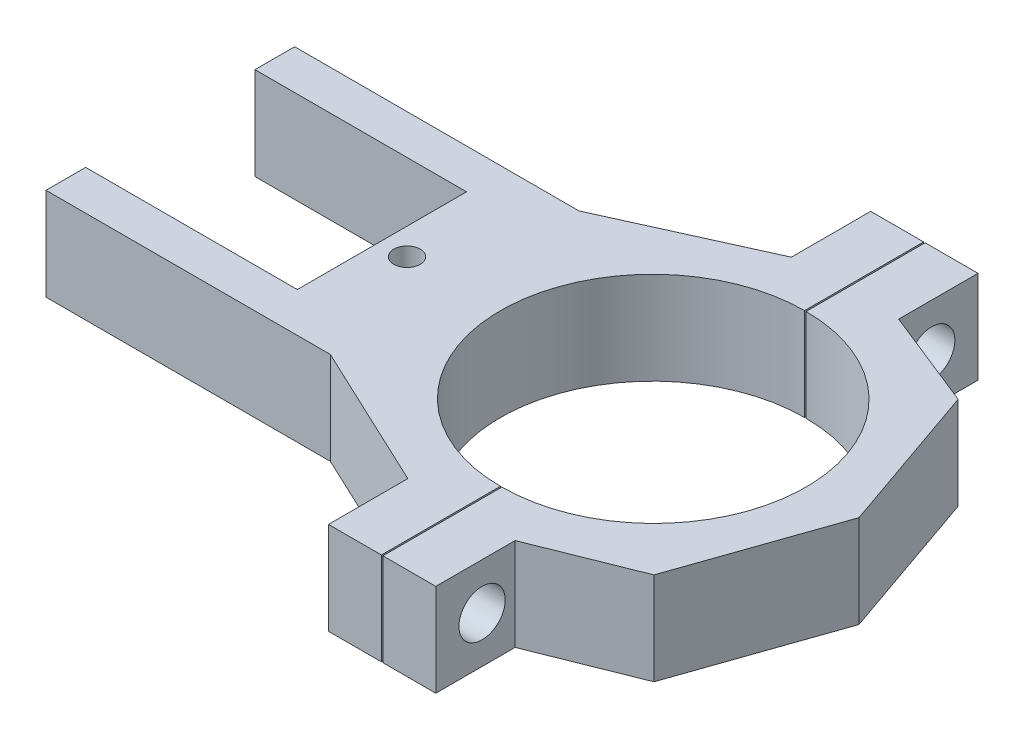
ISO-10303-21;
HEADER;
FILE_DESCRIPTION(('STEP AP214'),'2;1');
FILE_NAME('part.step','',(''),(''),'','','');
FILE_SCHEMA(('AUTOMOTIVE_DESIGN { 1 0 10303 214 1 1 1 1 }'));
ENDSEC;
DATA;
#1=APPLICATION_CONTEXT('core data for automotive mechanical design processes');
#2=APPLICATION_PROTOCOL_DEFINITION('international standard','automotive_design',2000,#1);
#3=PRODUCT_CONTEXT('',#1,'mechanical');
#4=PRODUCT('Part','Part','',(#3));
#5=PRODUCT_RELATED_PRODUCT_CATEGORY('part','',(#4));
#6=PRODUCT_DEFINITION_FORMATION('','',#4);
#7=PRODUCT_DEFINITION_CONTEXT('part definition',#1,'design');
#8=PRODUCT_DEFINITION('design','',#6,#7);
#9=PRODUCT_DEFINITION_SHAPE('','',#8);
#10=(LENGTH_UNIT() NAMED_UNIT(*) SI_UNIT(.MILLI.,.METRE.));
#11=(NAMED_UNIT(*) PLANE_ANGLE_UNIT() SI_UNIT($,.RADIAN.));
#12=(NAMED_UNIT(*) SI_UNIT($,.STERADIAN.) SOLID_ANGLE_UNIT());
#13=UNCERTAINTY_MEASURE_WITH_UNIT(LENGTH_MEASURE(1.E-05),#10,'distance_accuracy_value','');
#14=(GEOMETRIC_REPRESENTATION_CONTEXT(3) GLOBAL_UNCERTAINTY_ASSIGNED_CONTEXT((#13)) GLOBAL_UNIT_ASSIGNED_CONTEXT((#10,
#11,#12)) REPRESENTATION_CONTEXT('',''));
#15=CARTESIAN_POINT('',(0.,0.,0.));
#16=DIRECTION('',(0.,0.,1.));
#17=DIRECTION('',(1.,0.,0.));
#18=AXIS2_PLACEMENT_3D('',#15,#16,#17);
#19=CARTESIAN_POINT('',(23.4249580344917,7.,3.4829096426353));
#20=DIRECTION('',(0.,-1.,0.));
#21=DIRECTION('',(0.,0.,-1.));
#22=AXIS2_PLACEMENT_3D('',#19,#20,#21);
#23=CYLINDRICAL_SURFACE('',#22,11.4994374861079);
#24=CARTESIAN_POINT('',(23.4249580344917,0.,3.4829096426353));
#25=DIRECTION('',(0.,-1.,0.));
#26=DIRECTION('',(0.,0.,1.));
#27=AXIS2_PLACEMENT_3D('',#24,#25,#26);
#28=CIRCLE('',#27,11.4994374861079);
#29=CARTESIAN_POINT('',(23.4249580344917,0.,-8.01652784347259));
#30=VERTEX_POINT('',#29);
#31=CARTESIAN_POINT('',(23.4249580344917,0.,14.9823471287432));
#32=VERTEX_POINT('',#31);
#33=EDGE_CURVE('E161',#30,#32,#28,.T.);
#34=ORIENTED_EDGE('',*,*,#33,.T.);
#35=DIRECTION('',(0.,-1.,0.));
#36=VECTOR('',#35,1.);
#37=CARTESIAN_POINT('',(23.4249580344917,7.,14.9823471287432));
#38=LINE('',#37,#36);
#39=CARTESIAN_POINT('',(23.4249580344917,7.,14.9823471287432));
#40=VERTEX_POINT('',#39);
#41=EDGE_CURVE('E12',#40,#32,#38,.T.);
#42=ORIENTED_EDGE('',*,*,#41,.F.);
#43=CARTESIAN_POINT('',(23.4249580344917,7.,3.4829096426353));
#44=DIRECTION('',(0.,-1.,0.));
#45=DIRECTION('',(0.,0.,1.));
#46=AXIS2_PLACEMENT_3D('',#43,#44,#45);
#47=CIRCLE('',#46,11.4994374861079);
#48=CARTESIAN_POINT('',(23.4249580344917,7.,-8.01652784347259));
#49=VERTEX_POINT('',#48);
#50=EDGE_CURVE('E182',#49,#40,#47,.T.);
#51=ORIENTED_EDGE('',*,*,#50,.F.);
#52=DIRECTION('',(0.,-1.,0.));
#53=VECTOR('',#52,1.);
#54=CARTESIAN_POINT('',(23.4249580344917,7.,-8.01652784347259));
#55=LINE('',#54,#53);
#56=EDGE_CURVE('E157',#49,#30,#55,.T.);
#57=ORIENTED_EDGE('',*,*,#56,.T.);
#58=EDGE_LOOP('',(#34,#42,#51,#57));
#59=FACE_BOUND('',#58,.T.);
#60=ADVANCED_FACE('F45',(#59),#23,.F.);
#61=CARTESIAN_POINT('',(23.4249580344917,7.,14.9823471287432));
#62=DIRECTION('',(1.,0.,0.));
#63=DIRECTION('',(0.,0.,-1.));
#64=AXIS2_PLACEMENT_3D('',#61,#62,#63);
#65=PLANE('',#64);
#66=CARTESIAN_POINT('',(23.4249580344917,3.5,20.4829096426353));
#67=DIRECTION('',(1.,0.,0.));
#68=DIRECTION('',(0.,0.,-1.));
#69=AXIS2_PLACEMENT_3D('',#66,#67,#68);
#70=CIRCLE('',#69,1.75);
#71=CARTESIAN_POINT('',(23.4249580344917,3.5,18.7329096426353));
#72=VERTEX_POINT('',#71);
#73=EDGE_CURVE('E165',#72,#72,#70,.T.);
#74=ORIENTED_EDGE('',*,*,#73,.T.);
#75=EDGE_LOOP('',(#74));
#76=FACE_BOUND('',#75,.T.);
#77=DIRECTION('',(0.,0.,1.));
#78=VECTOR('',#77,1.);
#79=CARTESIAN_POINT('',(23.4249580344917,0.,14.9823471287432));
#80=LINE('',#79,#78);
#81=CARTESIAN_POINT('',(23.4249580344917,0.,23.9823471287432));
#82=VERTEX_POINT('',#81);
#83=EDGE_CURVE('E164',#32,#82,#80,.T.);
#84=ORIENTED_EDGE('',*,*,#83,.T.);
#85=DIRECTION('',(0.,-1.,0.));
#86=VECTOR('',#85,1.);
#87=CARTESIAN_POINT('',(23.4249580344917,7.,23.9823471287432));
#88=LINE('',#87,#86);
#89=CARTESIAN_POINT('',(23.4249580344917,7.,23.9823471287432));
#90=VERTEX_POINT('',#89);
#91=EDGE_CURVE('E54',#90,#82,#88,.T.);
#92=ORIENTED_EDGE('',*,*,#91,.F.);
#93=DIRECTION('',(0.,0.,1.));
#94=VECTOR('',#93,1.);
#95=CARTESIAN_POINT('',(23.4249580344917,7.,14.9823471287432));
#96=LINE('',#95,#94);
#97=EDGE_CURVE('E115',#40,#90,#96,.T.);
#98=ORIENTED_EDGE('',*,*,#97,.F.);
#99=ORIENTED_EDGE('',*,*,#41,.T.);
#100=EDGE_LOOP('',(#84,#92,#98,#99));
#101=FACE_BOUND('',#100,.T.);
#102=ADVANCED_FACE('F255',(#76,#101),#65,.F.);
#103=CARTESIAN_POINT('',(23.4249580344917,7.,23.9823471287432));
#104=DIRECTION('',(0.,0.,-1.));
#105=DIRECTION('',(-1.,0.,0.));
#106=AXIS2_PLACEMENT_3D('',#103,#104,#105);
#107=PLANE('',#106);
#108=DIRECTION('',(1.,0.,0.));
#109=VECTOR('',#108,1.);
#110=CARTESIAN_POINT('',(23.4249580344917,0.,23.9823471287432));
#111=LINE('',#110,#109);
#112=CARTESIAN_POINT('',(27.4249580344917,0.,23.9823471287432));
#113=VERTEX_POINT('',#112);
#114=EDGE_CURVE('E167',#82,#113,#111,.T.);
#115=ORIENTED_EDGE('',*,*,#114,.T.);
#116=DIRECTION('',(0.,-1.,0.));
#117=VECTOR('',#116,1.);
#118=CARTESIAN_POINT('',(27.4249580344917,7.,23.9823471287432));
#119=LINE('',#118,#117);
#120=CARTESIAN_POINT('',(27.4249580344917,7.,23.9823471287432));
#121=VERTEX_POINT('',#120);
#122=EDGE_CURVE('E198',#121,#113,#119,.T.);
#123=ORIENTED_EDGE('',*,*,#122,.F.);
#124=DIRECTION('',(1.,0.,0.));
#125=VECTOR('',#124,1.);
#126=CARTESIAN_POINT('',(23.4249580344917,7.,23.9823471287432));
#127=LINE('',#126,#125);
#128=EDGE_CURVE('E217',#90,#121,#127,.T.);
#129=ORIENTED_EDGE('',*,*,#128,.F.);
#130=ORIENTED_EDGE('',*,*,#91,.T.);
#131=EDGE_LOOP('',(#115,#123,#129,#130));
#132=FACE_BOUND('',#131,.T.);
#133=ADVANCED_FACE('F259',(#132),#107,.F.);
#134=CARTESIAN_POINT('',(27.4249580344917,7.,23.9823471287432));
#135=DIRECTION('',(-1.,0.,0.));
#136=DIRECTION('',(0.,0.,1.));
#137=AXIS2_PLACEMENT_3D('',#134,#135,#136);
#138=PLANE('',#137);
#139=CARTESIAN_POINT('',(27.4249580344917,3.5,20.4829096426353));
#140=DIRECTION('',(-1.,0.,0.));
#141=DIRECTION('',(0.,0.,1.));
#142=AXIS2_PLACEMENT_3D('',#139,#140,#141);
#143=CIRCLE('',#142,1.75);
#144=CARTESIAN_POINT('',(27.4249580344917,3.5,22.2329096426353));
#145=VERTEX_POINT('',#144);
#146=EDGE_CURVE('E202',#145,#145,#143,.T.);
#147=ORIENTED_EDGE('',*,*,#146,.T.);
#148=EDGE_LOOP('',(#147));
#149=FACE_BOUND('',#148,.T.);
#150=DIRECTION('',(0.,0.,-1.));
#151=VECTOR('',#150,1.);
#152=CARTESIAN_POINT('',(27.4249580344917,0.,23.9823471287432));
#153=LINE('',#152,#151);
#154=CARTESIAN_POINT('',(27.4249580344917,0.,17.9823471287432));
#155=VERTEX_POINT('',#154);
#156=EDGE_CURVE('E169',#113,#155,#153,.T.);
#157=ORIENTED_EDGE('',*,*,#156,.T.);
#158=DIRECTION('',(0.,-1.,0.));
#159=VECTOR('',#158,1.);
#160=CARTESIAN_POINT('',(27.4249580344917,7.,17.9823471287432));
#161=LINE('',#160,#159);
#162=CARTESIAN_POINT('',(27.4249580344917,7.,17.9823471287432));
#163=VERTEX_POINT('',#162);
#164=EDGE_CURVE('E195',#163,#155,#161,.T.);
#165=ORIENTED_EDGE('',*,*,#164,.F.);
#166=DIRECTION('',(0.,0.,-1.));
#167=VECTOR('',#166,1.);
#168=CARTESIAN_POINT('',(27.4249580344917,7.,23.9823471287432));
#169=LINE('',#168,#167);
#170=EDGE_CURVE('E219',#121,#163,#169,.T.);
#171=ORIENTED_EDGE('',*,*,#170,.F.);
#172=ORIENTED_EDGE('',*,*,#122,.T.);
#173=EDGE_LOOP('',(#157,#165,#171,#172));
#174=FACE_BOUND('',#173,.T.);
#175=ADVANCED_FACE('F264',(#149,#174),#138,.F.);
#176=CARTESIAN_POINT('',(34.9243955205996,7.,14.9823471287432));
#177=DIRECTION('',(-0.371414690703817,0.,-0.928467084785125));
#178=DIRECTION('',(-0.928467084785125,0.,0.371414690703817));
#179=AXIS2_PLACEMENT_3D('',#176,#177,#178);
#180=PLANE('',#179);
#181=DIRECTION('',(0.928467084785125,0.,-0.371414690703817));
#182=VECTOR('',#181,1.);
#183=CARTESIAN_POINT('',(34.9243955205996,0.,14.9823471287432));
#184=LINE('',#183,#182);
#185=CARTESIAN_POINT('',(34.9243955205996,0.,14.9823471287432));
#186=VERTEX_POINT('',#185);
#187=EDGE_CURVE('E171',#155,#186,#184,.T.);
#188=ORIENTED_EDGE('',*,*,#187,.T.);
#189=DIRECTION('',(0.,-1.,0.));
#190=VECTOR('',#189,1.);
#191=CARTESIAN_POINT('',(34.9243955205996,7.,14.9823471287432));
#192=LINE('',#191,#190);
#193=CARTESIAN_POINT('',(34.9243955205996,7.,14.9823471287432));
#194=VERTEX_POINT('',#193);
#195=EDGE_CURVE('E192',#194,#186,#192,.T.);
#196=ORIENTED_EDGE('',*,*,#195,.F.);
#197=DIRECTION('',(0.928467084785125,0.,-0.371414690703817));
#198=VECTOR('',#197,1.);
#199=CARTESIAN_POINT('',(34.9243955205996,7.,14.9823471287432));
#200=LINE('',#199,#198);
#201=EDGE_CURVE('E221',#163,#194,#200,.T.);
#202=ORIENTED_EDGE('',*,*,#201,.F.);
#203=ORIENTED_EDGE('',*,*,#164,.T.);
#204=EDGE_LOOP('',(#188,#196,#202,#203));
#205=FACE_BOUND('',#204,.T.);
#206=ADVANCED_FACE('F270',(#205),#180,.F.);
#207=CARTESIAN_POINT('',(38.9249580344917,7.,3.48290964263533));
#208=DIRECTION('',(-0.944477473376483,0.,-0.328576174249404));
#209=DIRECTION('',(-0.328576174249404,0.,0.944477473376483));
#210=AXIS2_PLACEMENT_3D('',#207,#208,#209);
#211=PLANE('',#210);
#212=DIRECTION('',(0.328576174249404,0.,-0.944477473376483));
#213=VECTOR('',#212,1.);
#214=CARTESIAN_POINT('',(38.9249580344917,0.,3.48290964263533));
#215=LINE('',#214,#213);
#216=CARTESIAN_POINT('',(38.9249580344917,0.,3.48290964263533));
#217=VERTEX_POINT('',#216);
#218=EDGE_CURVE('E173',#186,#217,#215,.T.);
#219=ORIENTED_EDGE('',*,*,#218,.T.);
#220=DIRECTION('',(0.,-1.,0.));
#221=VECTOR('',#220,1.);
#222=CARTESIAN_POINT('',(38.9249580344917,7.,3.48290964263533));
#223=LINE('',#222,#221);
#224=CARTESIAN_POINT('',(38.9249580344917,7.,3.48290964263533));
#225=VERTEX_POINT('',#224);
#226=EDGE_CURVE('E189',#225,#217,#223,.T.);
#227=ORIENTED_EDGE('',*,*,#226,.F.);
#228=DIRECTION('',(0.328576174249404,0.,-0.944477473376483));
#229=VECTOR('',#228,1.);
#230=CARTESIAN_POINT('',(38.9249580344917,7.,3.48290964263533));
#231=LINE('',#230,#229);
#232=EDGE_CURVE('E223',#194,#225,#231,.T.);
#233=ORIENTED_EDGE('',*,*,#232,.F.);
#234=ORIENTED_EDGE('',*,*,#195,.T.);
#235=EDGE_LOOP('',(#219,#227,#233,#234));
#236=FACE_BOUND('',#235,.T.);
#237=ADVANCED_FACE('F273',(#236),#211,.F.);
#238=CARTESIAN_POINT('',(34.9243955205996,7.,-8.01652784347259));
#239=DIRECTION('',(-0.944477473376483,0.,0.328576174249402));
#240=DIRECTION('',(0.328576174249402,0.,0.944477473376484));
#241=AXIS2_PLACEMENT_3D('',#238,#239,#240);
#242=PLANE('',#241);
#243=DIRECTION('',(-0.328576174249402,0.,-0.944477473376483));
#244=VECTOR('',#243,1.);
#245=CARTESIAN_POINT('',(34.9243955205996,0.,-8.01652784347259));
#246=LINE('',#245,#244);
#247=CARTESIAN_POINT('',(34.9243955205996,0.,-8.01652784347259));
#248=VERTEX_POINT('',#247);
#249=EDGE_CURVE('E175',#217,#248,#246,.T.);
#250=ORIENTED_EDGE('',*,*,#249,.T.);
#251=DIRECTION('',(0.,-1.,0.));
#252=VECTOR('',#251,1.);
#253=CARTESIAN_POINT('',(34.9243955205996,7.,-8.01652784347259));
#254=LINE('',#253,#252);
#255=CARTESIAN_POINT('',(34.9243955205996,7.,-8.01652784347259));
#256=VERTEX_POINT('',#255);
#257=EDGE_CURVE('E186',#256,#248,#254,.T.);
#258=ORIENTED_EDGE('',*,*,#257,.F.);
#259=DIRECTION('',(-0.328576174249402,0.,-0.944477473376483));
#260=VECTOR('',#259,1.);
#261=CARTESIAN_POINT('',(34.9243955205996,7.,-8.01652784347259));
#262=LINE('',#261,#260);
#263=EDGE_CURVE('E225',#225,#256,#262,.T.);
#264=ORIENTED_EDGE('',*,*,#263,.F.);
#265=ORIENTED_EDGE('',*,*,#226,.T.);
#266=EDGE_LOOP('',(#250,#258,#264,#265));
#267=FACE_BOUND('',#266,.T.);
#268=ADVANCED_FACE('F231',(#267),#242,.F.);
#269=CARTESIAN_POINT('',(27.4249580344917,7.,-11.0165278434726));
#270=DIRECTION('',(-0.371414690703817,0.,0.928467084785125));
#271=DIRECTION('',(0.928467084785125,0.,0.371414690703817));
#272=AXIS2_PLACEMENT_3D('',#269,#270,#271);
#273=PLANE('',#272);
#274=DIRECTION('',(-0.928467084785125,0.,-0.371414690703817));
#275=VECTOR('',#274,1.);
#276=CARTESIAN_POINT('',(27.4249580344917,0.,-11.0165278434726));
#277=LINE('',#276,#275);
#278=CARTESIAN_POINT('',(27.4249580344917,0.,-11.0165278434726));
#279=VERTEX_POINT('',#278);
#280=EDGE_CURVE('E177',#248,#279,#277,.T.);
#281=ORIENTED_EDGE('',*,*,#280,.T.);
#282=DIRECTION('',(0.,-1.,0.));
#283=VECTOR('',#282,1.);
#284=CARTESIAN_POINT('',(27.4249580344917,7.,-11.0165278434726));
#285=LINE('',#284,#283);
#286=CARTESIAN_POINT('',(27.4249580344917,7.,-11.0165278434726));
#287=VERTEX_POINT('',#286);
#288=EDGE_CURVE('E152',#287,#279,#285,.T.);
#289=ORIENTED_EDGE('',*,*,#288,.F.);
#290=DIRECTION('',(-0.928467084785125,0.,-0.371414690703817));
#291=VECTOR('',#290,1.);
#292=CARTESIAN_POINT('',(27.4249580344917,7.,-11.0165278434726));
#293=LINE('',#292,#291);
#294=EDGE_CURVE('E143',#256,#287,#293,.T.);
#295=ORIENTED_EDGE('',*,*,#294,.F.);
#296=ORIENTED_EDGE('',*,*,#257,.T.);
#297=EDGE_LOOP('',(#281,#289,#295,#296));
#298=FACE_BOUND('',#297,.T.);
#299=ADVANCED_FACE('F235',(#298),#273,.F.);
#300=CARTESIAN_POINT('',(27.4249580344917,7.,-17.0165278434726));
#301=DIRECTION('',(-1.,0.,0.));
#302=DIRECTION('',(0.,0.,1.));
#303=AXIS2_PLACEMENT_3D('',#300,#301,#302);
#304=PLANE('',#303);
#305=CARTESIAN_POINT('',(27.4249580344917,3.5,-13.5170903573647));
#306=DIRECTION('',(-1.,0.,0.));
#307=DIRECTION('',(0.,0.,1.));
#308=AXIS2_PLACEMENT_3D('',#305,#306,#307);
#309=CIRCLE('',#308,1.75);
#310=CARTESIAN_POINT('',(27.4249580344917,3.5,-11.7670903573647));
#311=VERTEX_POINT('',#310);
#312=EDGE_CURVE('E204',#311,#311,#309,.T.);
#313=ORIENTED_EDGE('',*,*,#312,.T.);
#314=EDGE_LOOP('',(#313));
#315=FACE_BOUND('',#314,.T.);
#316=DIRECTION('',(0.,0.,-1.));
#317=VECTOR('',#316,1.);
#318=CARTESIAN_POINT('',(27.4249580344917,0.,-17.0165278434726));
#319=LINE('',#318,#317);
#320=CARTESIAN_POINT('',(27.4249580344917,0.,-17.0165278434726));
#321=VERTEX_POINT('',#320);
#322=EDGE_CURVE('E151',#279,#321,#319,.T.);
#323=ORIENTED_EDGE('',*,*,#322,.T.);
#324=DIRECTION('',(0.,-1.,0.));
#325=VECTOR('',#324,1.);
#326=CARTESIAN_POINT('',(27.4249580344917,7.,-17.0165278434726));
#327=LINE('',#326,#325);
#328=CARTESIAN_POINT('',(27.4249580344917,7.,-17.0165278434726));
#329=VERTEX_POINT('',#328);
#330=EDGE_CURVE('E148',#329,#321,#327,.T.);
#331=ORIENTED_EDGE('',*,*,#330,.F.);
#332=DIRECTION('',(0.,0.,-1.));
#333=VECTOR('',#332,1.);
#334=CARTESIAN_POINT('',(27.4249580344917,7.,-17.0165278434726));
#335=LINE('',#334,#333);
#336=EDGE_CURVE('E137',#287,#329,#335,.T.);
#337=ORIENTED_EDGE('',*,*,#336,.F.);
#338=ORIENTED_EDGE('',*,*,#288,.T.);
#339=EDGE_LOOP('',(#323,#331,#337,#338));
#340=FACE_BOUND('',#339,.T.);
#341=ADVANCED_FACE('F149',(#315,#340),#304,.F.);
#342=CARTESIAN_POINT('',(23.4249580344917,7.,-17.0165278434726));
#343=DIRECTION('',(0.,0.,1.));
#344=DIRECTION('',(1.,0.,0.));
#345=AXIS2_PLACEMENT_3D('',#342,#343,#344);
#346=PLANE('',#345);
#347=DIRECTION('',(-1.,0.,0.));
#348=VECTOR('',#347,1.);
#349=CARTESIAN_POINT('',(23.4249580344917,0.,-17.0165278434726));
#350=LINE('',#349,#348);
#351=CARTESIAN_POINT('',(23.4249580344917,0.,-17.0165278434726));
#352=VERTEX_POINT('',#351);
#353=EDGE_CURVE('E101',#321,#352,#350,.T.);
#354=ORIENTED_EDGE('',*,*,#353,.T.);
#355=DIRECTION('',(0.,-1.,0.));
#356=VECTOR('',#355,1.);
#357=CARTESIAN_POINT('',(23.4249580344917,7.,-17.0165278434726));
#358=LINE('',#357,#356);
#359=CARTESIAN_POINT('',(23.4249580344917,7.,-17.0165278434726));
#360=VERTEX_POINT('',#359);
#361=EDGE_CURVE('E153',#360,#352,#358,.T.);
#362=ORIENTED_EDGE('',*,*,#361,.F.);
#363=DIRECTION('',(-1.,0.,0.));
#364=VECTOR('',#363,1.);
#365=CARTESIAN_POINT('',(23.4249580344917,7.,-17.0165278434726));
#366=LINE('',#365,#364);
#367=EDGE_CURVE('E141',#329,#360,#366,.T.);
#368=ORIENTED_EDGE('',*,*,#367,.F.);
#369=ORIENTED_EDGE('',*,*,#330,.T.);
#370=EDGE_LOOP('',(#354,#362,#368,#369));
#371=FACE_BOUND('',#370,.T.);
#372=ADVANCED_FACE('F155',(#371),#346,.F.);
#373=CARTESIAN_POINT('',(23.4249580344917,7.,-8.01652784347259));
#374=DIRECTION('',(1.,0.,0.));
#375=DIRECTION('',(0.,0.,-1.));
#376=AXIS2_PLACEMENT_3D('',#373,#374,#375);
#377=PLANE('',#376);
#378=CARTESIAN_POINT('',(23.4249580344917,3.5,-13.5170903573647));
#379=DIRECTION('',(1.,0.,0.));
#380=DIRECTION('',(0.,0.,-1.));
#381=AXIS2_PLACEMENT_3D('',#378,#379,#380);
#382=CIRCLE('',#381,1.75);
#383=CARTESIAN_POINT('',(23.4249580344917,3.5,-15.2670903573647));
#384=VERTEX_POINT('',#383);
#385=EDGE_CURVE('E48',#384,#384,#382,.T.);
#386=ORIENTED_EDGE('',*,*,#385,.T.);
#387=EDGE_LOOP('',(#386));
#388=FACE_BOUND('',#387,.T.);
#389=DIRECTION('',(0.,0.,1.));
#390=VECTOR('',#389,1.);
#391=CARTESIAN_POINT('',(23.4249580344917,0.,-8.01652784347259));
#392=LINE('',#391,#390);
#393=EDGE_CURVE('E107',#352,#30,#392,.T.);
#394=ORIENTED_EDGE('',*,*,#393,.T.);
#395=ORIENTED_EDGE('',*,*,#56,.F.);
#396=DIRECTION('',(0.,0.,1.));
#397=VECTOR('',#396,1.);
#398=CARTESIAN_POINT('',(23.4249580344917,7.,-8.01652784347259));
#399=LINE('',#398,#397);
#400=EDGE_CURVE('E63',#360,#49,#399,.T.);
#401=ORIENTED_EDGE('',*,*,#400,.F.);
#402=ORIENTED_EDGE('',*,*,#361,.T.);
#403=EDGE_LOOP('',(#394,#395,#401,#402));
#404=FACE_BOUND('',#403,.T.);
#405=ADVANCED_FACE('F243',(#388,#404),#377,.F.);
#406=CARTESIAN_POINT('',(23.4249580344917,7.,3.4829096426353));
#407=DIRECTION('',(0.,1.,0.));
#408=DIRECTION('',(0.,0.,1.));
#409=AXIS2_PLACEMENT_3D('',#406,#407,#408);
#410=PLANE('',#409);
#411=ORIENTED_EDGE('',*,*,#50,.T.);
#412=ORIENTED_EDGE('',*,*,#97,.T.);
#413=ORIENTED_EDGE('',*,*,#128,.T.);
#414=ORIENTED_EDGE('',*,*,#170,.T.);
#415=ORIENTED_EDGE('',*,*,#201,.T.);
#416=ORIENTED_EDGE('',*,*,#232,.T.);
#417=ORIENTED_EDGE('',*,*,#263,.T.);
#418=ORIENTED_EDGE('',*,*,#294,.T.);
#419=ORIENTED_EDGE('',*,*,#336,.T.);
#420=ORIENTED_EDGE('',*,*,#367,.T.);
#421=ORIENTED_EDGE('',*,*,#400,.T.);
#422=EDGE_LOOP('',(#411,#412,#413,#414,#415,#416,#417,#418,#419,#420,#421));
#423=FACE_BOUND('',#422,.T.);
#424=ADVANCED_FACE('F139',(#423),#410,.T.);
#425=CARTESIAN_POINT('',(23.4249580344917,0.,3.4829096426353));
#426=DIRECTION('',(0.,1.,0.));
#427=DIRECTION('',(0.,0.,1.));
#428=AXIS2_PLACEMENT_3D('',#425,#426,#427);
#429=PLANE('',#428);
#430=ORIENTED_EDGE('',*,*,#33,.F.);
#431=ORIENTED_EDGE('',*,*,#393,.F.);
#432=ORIENTED_EDGE('',*,*,#353,.F.);
#433=ORIENTED_EDGE('',*,*,#322,.F.);
#434=ORIENTED_EDGE('',*,*,#280,.F.);
#435=ORIENTED_EDGE('',*,*,#249,.F.);
#436=ORIENTED_EDGE('',*,*,#218,.F.);
#437=ORIENTED_EDGE('',*,*,#187,.F.);
#438=ORIENTED_EDGE('',*,*,#156,.F.);
#439=ORIENTED_EDGE('',*,*,#114,.F.);
#440=ORIENTED_EDGE('',*,*,#83,.F.);
#441=EDGE_LOOP('',(#430,#431,#432,#433,#434,#435,#436,#437,#438,#439,#440));
#442=FACE_BOUND('',#441,.T.);
#443=ADVANCED_FACE('F238',(#442),#429,.F.);
#444=CARTESIAN_POINT('',(38.9249580344917,3.5,20.4829096426353));
#445=DIRECTION('',(-1.,0.,0.));
#446=DIRECTION('',(0.,0.,1.));
#447=AXIS2_PLACEMENT_3D('',#444,#445,#446);
#448=CYLINDRICAL_SURFACE('',#447,1.75);
#449=ORIENTED_EDGE('',*,*,#146,.F.);
#450=EDGE_LOOP('',(#449));
#451=FACE_BOUND('',#450,.T.);
#452=ORIENTED_EDGE('',*,*,#73,.F.);
#453=EDGE_LOOP('',(#452));
#454=FACE_BOUND('',#453,.T.);
#455=ADVANCED_FACE('F310',(#451,#454),#448,.F.);
#456=CARTESIAN_POINT('',(38.9249580344917,3.5,-13.5170903573647));
#457=DIRECTION('',(-1.,0.,0.));
#458=DIRECTION('',(0.,0.,1.));
#459=AXIS2_PLACEMENT_3D('',#456,#457,#458);
#460=CYLINDRICAL_SURFACE('',#459,1.75);
#461=ORIENTED_EDGE('',*,*,#385,.F.);
#462=EDGE_LOOP('',(#461));
#463=FACE_BOUND('',#462,.T.);
#464=ORIENTED_EDGE('',*,*,#312,.F.);
#465=EDGE_LOOP('',(#464));
#466=FACE_BOUND('',#465,.T.);
#467=ADVANCED_FACE('F330',(#463,#466),#460,.F.);
#468=CLOSED_SHELL('',(#60,#102,#133,#175,#206,#237,#268,#299,#341,#372,#405,#424,#443,#455,#467));
#469=MANIFOLD_SOLID_BREP('B2',#468);
#470=CARTESIAN_POINT('',(-13.2478148366392,7.,-6.0170903573647));
#471=DIRECTION('',(0.,0.,1.));
#472=DIRECTION('',(1.,0.,0.));
#473=AXIS2_PLACEMENT_3D('',#470,#471,#472);
#474=PLANE('',#473);
#475=DIRECTION('',(-1.,0.,0.));
#476=VECTOR('',#475,1.);
#477=CARTESIAN_POINT('',(-13.2478148366392,0.,-6.0170903573647));
#478=LINE('',#477,#476);
#479=CARTESIAN_POINT('',(8.25218516336076,0.,-6.0170903573647));
#480=VERTEX_POINT('',#479);
#481=CARTESIAN_POINT('',(-13.2478148366392,0.,-6.0170903573647));
#482=VERTEX_POINT('',#481);
#483=EDGE_CURVE('E538',#480,#482,#478,.T.);
#484=ORIENTED_EDGE('',*,*,#483,.T.);
#485=DIRECTION('',(0.,-1.,0.));
#486=VECTOR('',#485,1.);
#487=CARTESIAN_POINT('',(-13.2478148366392,7.,-6.0170903573647));
#488=LINE('',#487,#486);
#489=CARTESIAN_POINT('',(-13.2478148366392,7.,-6.0170903573647));
#490=VERTEX_POINT('',#489);
#491=EDGE_CURVE('E43',#490,#482,#488,.T.);
#492=ORIENTED_EDGE('',*,*,#491,.F.);
#493=DIRECTION('',(-1.,0.,0.));
#494=VECTOR('',#493,1.);
#495=CARTESIAN_POINT('',(-13.2478148366392,7.,-6.0170903573647));
#496=LINE('',#495,#494);
#497=CARTESIAN_POINT('',(8.25218516336076,7.,-6.0170903573647));
#498=VERTEX_POINT('',#497);
#499=EDGE_CURVE('E568',#498,#490,#496,.T.);
#500=ORIENTED_EDGE('',*,*,#499,.F.);
#501=DIRECTION('',(0.,-1.,0.));
#502=VECTOR('',#501,1.);
#503=CARTESIAN_POINT('',(8.25218516336076,7.,-6.0170903573647));
#504=LINE('',#503,#502);
#505=EDGE_CURVE('E534',#498,#480,#504,.T.);
#506=ORIENTED_EDGE('',*,*,#505,.T.);
#507=EDGE_LOOP('',(#484,#492,#500,#506));
#508=FACE_BOUND('',#507,.T.);
#509=ADVANCED_FACE('F393',(#508),#474,.F.);
#510=CARTESIAN_POINT('',(-13.2478148366392,7.,-6.0170903573647));
#511=DIRECTION('',(1.,0.,0.));
#512=DIRECTION('',(0.,0.,-1.));
#513=AXIS2_PLACEMENT_3D('',#510,#511,#512);
#514=PLANE('',#513);
#515=DIRECTION('',(0.,0.,1.));
#516=VECTOR('',#515,1.);
#517=CARTESIAN_POINT('',(-13.2478148366392,0.,-6.0170903573647));
#518=LINE('',#517,#516);
#519=CARTESIAN_POINT('',(-13.2478148366392,0.,-3.0170903573647));
#520=VERTEX_POINT('',#519);
#521=EDGE_CURVE('E541',#482,#520,#518,.T.);
#522=ORIENTED_EDGE('',*,*,#521,.T.);
#523=DIRECTION('',(0.,-1.,0.));
#524=VECTOR('',#523,1.);
#525=CARTESIAN_POINT('',(-13.2478148366392,7.,-3.0170903573647));
#526=LINE('',#525,#524);
#527=CARTESIAN_POINT('',(-13.2478148366392,7.,-3.0170903573647));
#528=VERTEX_POINT('',#527);
#529=EDGE_CURVE('E402',#528,#520,#526,.T.);
#530=ORIENTED_EDGE('',*,*,#529,.F.);
#531=DIRECTION('',(0.,0.,1.));
#532=VECTOR('',#531,1.);
#533=CARTESIAN_POINT('',(-13.2478148366392,7.,-6.0170903573647));
#534=LINE('',#533,#532);
#535=EDGE_CURVE('E477',#490,#528,#534,.T.);
#536=ORIENTED_EDGE('',*,*,#535,.F.);
#537=ORIENTED_EDGE('',*,*,#491,.T.);
#538=EDGE_LOOP('',(#522,#530,#536,#537));
#539=FACE_BOUND('',#538,.T.);
#540=ADVANCED_FACE('F669',(#539),#514,.F.);
#541=CARTESIAN_POINT('',(-13.2478148366392,7.,-3.0170903573647));
#542=DIRECTION('',(0.,0.,-1.));
#543=DIRECTION('',(-1.,0.,0.));
#544=AXIS2_PLACEMENT_3D('',#541,#542,#543);
#545=PLANE('',#544);
#546=DIRECTION('',(1.,0.,0.));
#547=VECTOR('',#546,1.);
#548=CARTESIAN_POINT('',(-13.2478148366392,0.,-3.0170903573647));
#549=LINE('',#548,#547);
#550=CARTESIAN_POINT('',(2.75218516336076,0.,-3.0170903573647));
#551=VERTEX_POINT('',#550);
#552=EDGE_CURVE('E543',#520,#551,#549,.T.);
#553=ORIENTED_EDGE('',*,*,#552,.T.);
#554=DIRECTION('',(0.,-1.,0.));
#555=VECTOR('',#554,1.);
#556=CARTESIAN_POINT('',(2.75218516336076,7.,-3.0170903573647));
#557=LINE('',#556,#555);
#558=CARTESIAN_POINT('',(2.75218516336076,7.,-3.0170903573647));
#559=VERTEX_POINT('',#558);
#560=EDGE_CURVE('E599',#559,#551,#557,.T.);
#561=ORIENTED_EDGE('',*,*,#560,.F.);
#562=DIRECTION('',(1.,0.,0.));
#563=VECTOR('',#562,1.);
#564=CARTESIAN_POINT('',(-13.2478148366392,7.,-3.0170903573647));
#565=LINE('',#564,#563);
#566=EDGE_CURVE('E608',#528,#559,#565,.T.);
#567=ORIENTED_EDGE('',*,*,#566,.F.);
#568=ORIENTED_EDGE('',*,*,#529,.T.);
#569=EDGE_LOOP('',(#553,#561,#567,#568));
#570=FACE_BOUND('',#569,.T.);
#571=ADVANCED_FACE('F606',(#570),#545,.F.);
#572=CARTESIAN_POINT('',(2.75218516336076,7.,-3.0170903573647));
#573=DIRECTION('',(1.,0.,0.));
#574=DIRECTION('',(0.,0.,-1.));
#575=AXIS2_PLACEMENT_3D('',#572,#573,#574);
#576=PLANE('',#575);
#577=DIRECTION('',(0.,0.,1.));
#578=VECTOR('',#577,1.);
#579=CARTESIAN_POINT('',(2.75218516336076,0.,-3.0170903573647));
#580=LINE('',#579,#578);
#581=CARTESIAN_POINT('',(2.75218516336077,0.,9.78290964263531));
#582=VERTEX_POINT('',#581);
#583=EDGE_CURVE('E545',#551,#582,#580,.T.);
#584=ORIENTED_EDGE('',*,*,#583,.T.);
#585=DIRECTION('',(0.,-1.,0.));
#586=VECTOR('',#585,1.);
#587=CARTESIAN_POINT('',(2.75218516336077,7.,9.78290964263531));
#588=LINE('',#587,#586);
#589=CARTESIAN_POINT('',(2.75218516336077,7.,9.78290964263531));
#590=VERTEX_POINT('',#589);
#591=EDGE_CURVE('E596',#590,#582,#588,.T.);
#592=ORIENTED_EDGE('',*,*,#591,.F.);
#593=DIRECTION('',(0.,0.,1.));
#594=VECTOR('',#593,1.);
#595=CARTESIAN_POINT('',(2.75218516336076,7.,-3.0170903573647));
#596=LINE('',#595,#594);
#597=EDGE_CURVE('E626',#559,#590,#596,.T.);
#598=ORIENTED_EDGE('',*,*,#597,.F.);
#599=ORIENTED_EDGE('',*,*,#560,.T.);
#600=EDGE_LOOP('',(#584,#592,#598,#599));
#601=FACE_BOUND('',#600,.T.);
#602=ADVANCED_FACE('F617',(#601),#576,.F.);
#603=CARTESIAN_POINT('',(2.75218516336077,7.,9.78290964263531));
#604=DIRECTION('',(0.,0.,1.));
#605=DIRECTION('',(1.,0.,0.));
#606=AXIS2_PLACEMENT_3D('',#603,#604,#605);
#607=PLANE('',#606);
#608=DIRECTION('',(-1.,0.,0.));
#609=VECTOR('',#608,1.);
#610=CARTESIAN_POINT('',(2.75218516336077,0.,9.78290964263531));
#611=LINE('',#610,#609);
#612=CARTESIAN_POINT('',(-13.2478148366392,0.,9.78290964263531));
#613=VERTEX_POINT('',#612);
#614=EDGE_CURVE('E547',#582,#613,#611,.T.);
#615=ORIENTED_EDGE('',*,*,#614,.T.);
#616=DIRECTION('',(0.,-1.,0.));
#617=VECTOR('',#616,1.);
#618=CARTESIAN_POINT('',(-13.2478148366392,7.,9.78290964263531));
#619=LINE('',#618,#617);
#620=CARTESIAN_POINT('',(-13.2478148366392,7.,9.78290964263531));
#621=VERTEX_POINT('',#620);
#622=EDGE_CURVE('E593',#621,#613,#619,.T.);
#623=ORIENTED_EDGE('',*,*,#622,.F.);
#624=DIRECTION('',(-1.,0.,0.));
#625=VECTOR('',#624,1.);
#626=CARTESIAN_POINT('',(2.75218516336077,7.,9.78290964263531));
#627=LINE('',#626,#625);
#628=EDGE_CURVE('E623',#590,#621,#627,.T.);
#629=ORIENTED_EDGE('',*,*,#628,.F.);
#630=ORIENTED_EDGE('',*,*,#591,.T.);
#631=EDGE_LOOP('',(#615,#623,#629,#630));
#632=FACE_BOUND('',#631,.T.);
#633=ADVANCED_FACE('F621',(#632),#607,.F.);
#634=CARTESIAN_POINT('',(-13.2478148366392,7.,9.78290964263531));
#635=DIRECTION('',(1.,0.,0.));
#636=DIRECTION('',(0.,0.,-1.));
#637=AXIS2_PLACEMENT_3D('',#634,#635,#636);
#638=PLANE('',#637);
#639=DIRECTION('',(0.,0.,1.));
#640=VECTOR('',#639,1.);
#641=CARTESIAN_POINT('',(-13.2478148366392,0.,9.78290964263531));
#642=LINE('',#641,#640);
#643=CARTESIAN_POINT('',(-13.2478148366392,0.,12.7829096426353));
#644=VERTEX_POINT('',#643);
#645=EDGE_CURVE('E549',#613,#644,#642,.T.);
#646=ORIENTED_EDGE('',*,*,#645,.T.);
#647=DIRECTION('',(0.,-1.,0.));
#648=VECTOR('',#647,1.);
#649=CARTESIAN_POINT('',(-13.2478148366392,7.,12.7829096426353));
#650=LINE('',#649,#648);
#651=CARTESIAN_POINT('',(-13.2478148366392,7.,12.7829096426353));
#652=VERTEX_POINT('',#651);
#653=EDGE_CURVE('E590',#652,#644,#650,.T.);
#654=ORIENTED_EDGE('',*,*,#653,.F.);
#655=DIRECTION('',(0.,0.,1.));
#656=VECTOR('',#655,1.);
#657=CARTESIAN_POINT('',(-13.2478148366392,7.,9.78290964263531));
#658=LINE('',#657,#656);
#659=EDGE_CURVE('E625',#621,#652,#658,.T.);
#660=ORIENTED_EDGE('',*,*,#659,.F.);
#661=ORIENTED_EDGE('',*,*,#622,.T.);
#662=EDGE_LOOP('',(#646,#654,#660,#661));
#663=FACE_BOUND('',#662,.T.);
#664=ADVANCED_FACE('F682',(#663),#638,.F.);
#665=CARTESIAN_POINT('',(-13.2478148366392,7.,12.7829096426353));
#666=DIRECTION('',(0.,0.,-1.));
#667=DIRECTION('',(-1.,0.,0.));
#668=AXIS2_PLACEMENT_3D('',#665,#666,#667);
#669=PLANE('',#668);
#670=DIRECTION('',(1.,0.,0.));
#671=VECTOR('',#670,1.);
#672=CARTESIAN_POINT('',(-13.2478148366392,0.,12.7829096426353));
#673=LINE('',#672,#671);
#674=CARTESIAN_POINT('',(8.25218516336076,0.,12.7829096426353));
#675=VERTEX_POINT('',#674);
#676=EDGE_CURVE('E551',#644,#675,#673,.T.);
#677=ORIENTED_EDGE('',*,*,#676,.T.);
#678=DIRECTION('',(0.,-1.,0.));
#679=VECTOR('',#678,1.);
#680=CARTESIAN_POINT('',(8.25218516336076,7.,12.7829096426353));
#681=LINE('',#680,#679);
#682=CARTESIAN_POINT('',(8.25218516336076,7.,12.7829096426353));
#683=VERTEX_POINT('',#682);
#684=EDGE_CURVE('E587',#683,#675,#681,.T.);
#685=ORIENTED_EDGE('',*,*,#684,.F.);
#686=DIRECTION('',(1.,0.,0.));
#687=VECTOR('',#686,1.);
#688=CARTESIAN_POINT('',(-13.2478148366392,7.,12.7829096426353));
#689=LINE('',#688,#687);
#690=EDGE_CURVE('E628',#652,#683,#689,.T.);
#691=ORIENTED_EDGE('',*,*,#690,.F.);
#692=ORIENTED_EDGE('',*,*,#653,.T.);
#693=EDGE_LOOP('',(#677,#685,#691,#692));
#694=FACE_BOUND('',#693,.T.);
#695=ADVANCED_FACE('F685',(#694),#669,.F.);
#696=CARTESIAN_POINT('',(19.3112148892183,7.,17.9829096426353));
#697=DIRECTION('',(0.42551234139911,0.,-0.904952621586924));
#698=DIRECTION('',(-0.904952621586924,0.,-0.42551234139911));
#699=AXIS2_PLACEMENT_3D('',#696,#697,#698);
#700=PLANE('',#699);
#701=DIRECTION('',(0.904952621586924,0.,0.42551234139911));
#702=VECTOR('',#701,1.);
#703=CARTESIAN_POINT('',(19.3112148892183,0.,17.9829096426353));
#704=LINE('',#703,#702);
#705=CARTESIAN_POINT('',(19.3112148892183,0.,17.9829096426353));
#706=VERTEX_POINT('',#705);
#707=EDGE_CURVE('E553',#675,#706,#704,.T.);
#708=ORIENTED_EDGE('',*,*,#707,.T.);
#709=DIRECTION('',(0.,-1.,0.));
#710=VECTOR('',#709,1.);
#711=CARTESIAN_POINT('',(19.3112148892183,7.,17.9829096426353));
#712=LINE('',#711,#710);
#713=CARTESIAN_POINT('',(19.3112148892183,7.,17.9829096426353));
#714=VERTEX_POINT('',#713);
#715=EDGE_CURVE('E584',#714,#706,#712,.T.);
#716=ORIENTED_EDGE('',*,*,#715,.F.);
#717=DIRECTION('',(0.904952621586924,0.,0.42551234139911));
#718=VECTOR('',#717,1.);
#719=CARTESIAN_POINT('',(19.3112148892183,7.,17.9829096426353));
#720=LINE('',#719,#718);
#721=EDGE_CURVE('E634',#683,#714,#720,.T.);
#722=ORIENTED_EDGE('',*,*,#721,.F.);
#723=ORIENTED_EDGE('',*,*,#684,.T.);
#724=EDGE_LOOP('',(#708,#716,#722,#723));
#725=FACE_BOUND('',#724,.T.);
#726=ADVANCED_FACE('F689',(#725),#700,.F.);
#727=CARTESIAN_POINT('',(19.3112148892183,7.,23.9829096426353));
#728=DIRECTION('',(1.,0.,0.));
#729=DIRECTION('',(0.,0.,-1.));
#730=AXIS2_PLACEMENT_3D('',#727,#728,#729);
#731=PLANE('',#730);
#732=CARTESIAN_POINT('',(19.3112148892183,3.5,20.4829096426353));
#733=DIRECTION('',(-1.,0.,0.));
#734=DIRECTION('',(0.,0.,1.));
#735=AXIS2_PLACEMENT_3D('',#732,#733,#734);
#736=CIRCLE('',#735,1.75);
#737=CARTESIAN_POINT('',(19.3112148892183,3.5,22.2329096426353));
#738=VERTEX_POINT('',#737);
#739=EDGE_CURVE('E774',#738,#738,#736,.T.);
#740=ORIENTED_EDGE('',*,*,#739,.F.);
#741=EDGE_LOOP('',(#740));
#742=FACE_BOUND('',#741,.T.);
#743=DIRECTION('',(0.,0.,1.));
#744=VECTOR('',#743,1.);
#745=CARTESIAN_POINT('',(19.3112148892183,0.,23.9829096426353));
#746=LINE('',#745,#744);
#747=CARTESIAN_POINT('',(19.3112148892183,0.,23.9829096426353));
#748=VERTEX_POINT('',#747);
#749=EDGE_CURVE('E555',#706,#748,#746,.T.);
#750=ORIENTED_EDGE('',*,*,#749,.T.);
#751=DIRECTION('',(0.,-1.,0.));
#752=VECTOR('',#751,1.);
#753=CARTESIAN_POINT('',(19.3112148892183,7.,23.9829096426353));
#754=LINE('',#753,#752);
#755=CARTESIAN_POINT('',(19.3112148892183,7.,23.9829096426353));
#756=VERTEX_POINT('',#755);
#757=EDGE_CURVE('E581',#756,#748,#754,.T.);
#758=ORIENTED_EDGE('',*,*,#757,.F.);
#759=DIRECTION('',(0.,0.,1.));
#760=VECTOR('',#759,1.);
#761=CARTESIAN_POINT('',(19.3112148892183,7.,23.9829096426353));
#762=LINE('',#761,#760);
#763=EDGE_CURVE('E636',#714,#756,#762,.T.);
#764=ORIENTED_EDGE('',*,*,#763,.F.);
#765=ORIENTED_EDGE('',*,*,#715,.T.);
#766=EDGE_LOOP('',(#750,#758,#764,#765));
#767=FACE_BOUND('',#766,.T.);
#768=ADVANCED_FACE('F693',(#742,#767),#731,.F.);
#769=CARTESIAN_POINT('',(23.3112148892183,7.,23.9829096426353));
#770=DIRECTION('',(0.,0.,-1.));
#771=DIRECTION('',(-1.,0.,0.));
#772=AXIS2_PLACEMENT_3D('',#769,#770,#771);
#773=PLANE('',#772);
#774=DIRECTION('',(1.,0.,0.));
#775=VECTOR('',#774,1.);
#776=CARTESIAN_POINT('',(23.3112148892183,0.,23.9829096426353));
#777=LINE('',#776,#775);
#778=CARTESIAN_POINT('',(23.3112148892183,0.,23.9829096426353));
#779=VERTEX_POINT('',#778);
#780=EDGE_CURVE('E557',#748,#779,#777,.T.);
#781=ORIENTED_EDGE('',*,*,#780,.T.);
#782=DIRECTION('',(0.,-1.,0.));
#783=VECTOR('',#782,1.);
#784=CARTESIAN_POINT('',(23.3112148892183,7.,23.9829096426353));
#785=LINE('',#784,#783);
#786=CARTESIAN_POINT('',(23.3112148892183,7.,23.9829096426353));
#787=VERTEX_POINT('',#786);
#788=EDGE_CURVE('E578',#787,#779,#785,.T.);
#789=ORIENTED_EDGE('',*,*,#788,.F.);
#790=DIRECTION('',(1.,0.,0.));
#791=VECTOR('',#790,1.);
#792=CARTESIAN_POINT('',(23.3112148892183,7.,23.9829096426353));
#793=LINE('',#792,#791);
#794=EDGE_CURVE('E638',#756,#787,#793,.T.);
#795=ORIENTED_EDGE('',*,*,#794,.F.);
#796=ORIENTED_EDGE('',*,*,#757,.T.);
#797=EDGE_LOOP('',(#781,#789,#795,#796));
#798=FACE_BOUND('',#797,.T.);
#799=ADVANCED_FACE('F697',(#798),#773,.F.);
#800=CARTESIAN_POINT('',(23.3112148892183,7.,14.9829096426353));
#801=DIRECTION('',(-1.,0.,0.));
#802=DIRECTION('',(0.,0.,1.));
#803=AXIS2_PLACEMENT_3D('',#800,#801,#802);
#804=PLANE('',#803);
#805=CARTESIAN_POINT('',(23.3112148892183,3.5,20.4829096426353));
#806=DIRECTION('',(-1.,0.,0.));
#807=DIRECTION('',(0.,0.,1.));
#808=AXIS2_PLACEMENT_3D('',#805,#806,#807);
#809=CIRCLE('',#808,1.75);
#810=CARTESIAN_POINT('',(23.3112148892183,3.5,22.2329096426353));
#811=VERTEX_POINT('',#810);
#812=EDGE_CURVE('E396',#811,#811,#809,.T.);
#813=ORIENTED_EDGE('',*,*,#812,.T.);
#814=EDGE_LOOP('',(#813));
#815=FACE_BOUND('',#814,.T.);
#816=DIRECTION('',(0.,0.,-1.));
#817=VECTOR('',#816,1.);
#818=CARTESIAN_POINT('',(23.3112148892183,0.,14.9829096426353));
#819=LINE('',#818,#817);
#820=CARTESIAN_POINT('',(23.3112148892183,0.,14.9829096426353));
#821=VERTEX_POINT('',#820);
#822=EDGE_CURVE('E559',#779,#821,#819,.T.);
#823=ORIENTED_EDGE('',*,*,#822,.T.);
#824=DIRECTION('',(0.,-1.,0.));
#825=VECTOR('',#824,1.);
#826=CARTESIAN_POINT('',(23.3112148892183,7.,14.9829096426353));
#827=LINE('',#826,#825);
#828=CARTESIAN_POINT('',(23.3112148892183,7.,14.9829096426353));
#829=VERTEX_POINT('',#828);
#830=EDGE_CURVE('E575',#829,#821,#827,.T.);
#831=ORIENTED_EDGE('',*,*,#830,.F.);
#832=DIRECTION('',(0.,0.,-1.));
#833=VECTOR('',#832,1.);
#834=CARTESIAN_POINT('',(23.3112148892183,7.,14.9829096426353));
#835=LINE('',#834,#833);
#836=EDGE_CURVE('E640',#787,#829,#835,.T.);
#837=ORIENTED_EDGE('',*,*,#836,.F.);
#838=ORIENTED_EDGE('',*,*,#788,.T.);
#839=EDGE_LOOP('',(#823,#831,#837,#838));
#840=FACE_BOUND('',#839,.T.);
#841=ADVANCED_FACE('F701',(#815,#840),#804,.F.);
#842=CARTESIAN_POINT('',(23.3112148892183,7.,3.4829096426353));
#843=DIRECTION('',(0.,-1.,0.));
#844=DIRECTION('',(0.,0.,-1.));
#845=AXIS2_PLACEMENT_3D('',#842,#843,#844);
#846=CYLINDRICAL_SURFACE('',#845,11.5);
#847=CARTESIAN_POINT('',(23.3112148892183,0.,3.4829096426353));
#848=DIRECTION('',(0.,-1.,0.));
#849=DIRECTION('',(0.,0.,1.));
#850=AXIS2_PLACEMENT_3D('',#847,#848,#849);
#851=CIRCLE('',#850,11.5);
#852=CARTESIAN_POINT('',(23.3112148892183,0.,-8.0170903573647));
#853=VERTEX_POINT('',#852);
#854=EDGE_CURVE('E561',#821,#853,#851,.T.);
#855=ORIENTED_EDGE('',*,*,#854,.T.);
#856=DIRECTION('',(0.,-1.,0.));
#857=VECTOR('',#856,1.);
#858=CARTESIAN_POINT('',(23.3112148892183,7.,-8.0170903573647));
#859=LINE('',#858,#857);
#860=CARTESIAN_POINT('',(23.3112148892183,7.,-8.0170903573647));
#861=VERTEX_POINT('',#860);
#862=EDGE_CURVE('E572',#861,#853,#859,.T.);
#863=ORIENTED_EDGE('',*,*,#862,.F.);
#864=CARTESIAN_POINT('',(23.3112148892183,7.,3.4829096426353));
#865=DIRECTION('',(0.,-1.,0.));
#866=DIRECTION('',(0.,0.,1.));
#867=AXIS2_PLACEMENT_3D('',#864,#865,#866);
#868=CIRCLE('',#867,11.5);
#869=EDGE_CURVE('E642',#829,#861,#868,.T.);
#870=ORIENTED_EDGE('',*,*,#869,.F.);
#871=ORIENTED_EDGE('',*,*,#830,.T.);
#872=EDGE_LOOP('',(#855,#863,#870,#871));
#873=FACE_BOUND('',#872,.T.);
#874=ADVANCED_FACE('F648',(#873),#846,.F.);
#875=CARTESIAN_POINT('',(23.3112148892183,7.,-8.0170903573647));
#876=DIRECTION('',(-1.,0.,0.));
#877=DIRECTION('',(0.,0.,1.));
#878=AXIS2_PLACEMENT_3D('',#875,#876,#877);
#879=PLANE('',#878);
#880=CARTESIAN_POINT('',(23.3112148892183,3.5,-13.5170903573647));
#881=DIRECTION('',(-1.,0.,0.));
#882=DIRECTION('',(0.,0.,1.));
#883=AXIS2_PLACEMENT_3D('',#880,#881,#882);
#884=CIRCLE('',#883,1.75);
#885=CARTESIAN_POINT('',(23.3112148892183,3.5,-11.7670903573647));
#886=VERTEX_POINT('',#885);
#887=EDGE_CURVE('E777',#886,#886,#884,.T.);
#888=ORIENTED_EDGE('',*,*,#887,.T.);
#889=EDGE_LOOP('',(#888));
#890=FACE_BOUND('',#889,.T.);
#891=DIRECTION('',(0.,0.,-1.));
#892=VECTOR('',#891,1.);
#893=CARTESIAN_POINT('',(23.3112148892183,0.,-8.0170903573647));
#894=LINE('',#893,#892);
#895=CARTESIAN_POINT('',(23.3112148892183,0.,-17.0170903573647));
#896=VERTEX_POINT('',#895);
#897=EDGE_CURVE('E563',#853,#896,#894,.T.);
#898=ORIENTED_EDGE('',*,*,#897,.T.);
#899=DIRECTION('',(0.,-1.,0.));
#900=VECTOR('',#899,1.);
#901=CARTESIAN_POINT('',(23.3112148892183,7.,-17.0170903573647));
#902=LINE('',#901,#900);
#903=CARTESIAN_POINT('',(23.3112148892183,7.,-17.0170903573647));
#904=VERTEX_POINT('',#903);
#905=EDGE_CURVE('E529',#904,#896,#902,.T.);
#906=ORIENTED_EDGE('',*,*,#905,.F.);
#907=DIRECTION('',(0.,0.,-1.));
#908=VECTOR('',#907,1.);
#909=CARTESIAN_POINT('',(23.3112148892183,7.,-8.0170903573647));
#910=LINE('',#909,#908);
#911=EDGE_CURVE('E520',#861,#904,#910,.T.);
#912=ORIENTED_EDGE('',*,*,#911,.F.);
#913=ORIENTED_EDGE('',*,*,#862,.T.);
#914=EDGE_LOOP('',(#898,#906,#912,#913));
#915=FACE_BOUND('',#914,.T.);
#916=ADVANCED_FACE('F652',(#890,#915),#879,.F.);
#917=CARTESIAN_POINT('',(23.3112148892183,7.,-17.0170903573647));
#918=DIRECTION('',(0.,0.,1.));
#919=DIRECTION('',(1.,0.,0.));
#920=AXIS2_PLACEMENT_3D('',#917,#918,#919);
#921=PLANE('',#920);
#922=DIRECTION('',(-1.,0.,0.));
#923=VECTOR('',#922,1.);
#924=CARTESIAN_POINT('',(23.3112148892183,0.,-17.0170903573647));
#925=LINE('',#924,#923);
#926=CARTESIAN_POINT('',(19.3112148892183,0.,-17.0170903573647));
#927=VERTEX_POINT('',#926);
#928=EDGE_CURVE('E528',#896,#927,#925,.T.);
#929=ORIENTED_EDGE('',*,*,#928,.T.);
#930=DIRECTION('',(0.,-1.,0.));
#931=VECTOR('',#930,1.);
#932=CARTESIAN_POINT('',(19.3112148892183,7.,-17.0170903573647));
#933=LINE('',#932,#931);
#934=CARTESIAN_POINT('',(19.3112148892183,7.,-17.0170903573647));
#935=VERTEX_POINT('',#934);
#936=EDGE_CURVE('E525',#935,#927,#933,.T.);
#937=ORIENTED_EDGE('',*,*,#936,.F.);
#938=DIRECTION('',(-1.,0.,0.));
#939=VECTOR('',#938,1.);
#940=CARTESIAN_POINT('',(23.3112148892183,7.,-17.0170903573647));
#941=LINE('',#940,#939);
#942=EDGE_CURVE('E514',#904,#935,#941,.T.);
#943=ORIENTED_EDGE('',*,*,#942,.F.);
#944=ORIENTED_EDGE('',*,*,#905,.T.);
#945=EDGE_LOOP('',(#929,#937,#943,#944));
#946=FACE_BOUND('',#945,.T.);
#947=ADVANCED_FACE('F526',(#946),#921,.F.);
#948=CARTESIAN_POINT('',(19.3112148892183,7.,-17.0170903573647));
#949=DIRECTION('',(1.,0.,0.));
#950=DIRECTION('',(0.,0.,-1.));
#951=AXIS2_PLACEMENT_3D('',#948,#949,#950);
#952=PLANE('',#951);
#953=CARTESIAN_POINT('',(19.3112148892183,3.5,-13.5170903573647));
#954=DIRECTION('',(-1.,0.,0.));
#955=DIRECTION('',(0.,0.,1.));
#956=AXIS2_PLACEMENT_3D('',#953,#954,#955);
#957=CIRCLE('',#956,1.75);
#958=CARTESIAN_POINT('',(19.3112148892183,3.5,-11.7670903573647));
#959=VERTEX_POINT('',#958);
#960=EDGE_CURVE('E780',#959,#959,#957,.T.);
#961=ORIENTED_EDGE('',*,*,#960,.F.);
#962=EDGE_LOOP('',(#961));
#963=FACE_BOUND('',#962,.T.);
#964=DIRECTION('',(0.,0.,1.));
#965=VECTOR('',#964,1.);
#966=CARTESIAN_POINT('',(19.3112148892183,0.,-17.0170903573647));
#967=LINE('',#966,#965);
#968=CARTESIAN_POINT('',(19.3112148892183,0.,-11.0170903573647));
#969=VERTEX_POINT('',#968);
#970=EDGE_CURVE('E463',#927,#969,#967,.T.);
#971=ORIENTED_EDGE('',*,*,#970,.T.);
#972=DIRECTION('',(0.,-1.,0.));
#973=VECTOR('',#972,1.);
#974=CARTESIAN_POINT('',(19.3112148892183,7.,-11.0170903573647));
#975=LINE('',#974,#973);
#976=CARTESIAN_POINT('',(19.3112148892183,7.,-11.0170903573647));
#977=VERTEX_POINT('',#976);
#978=EDGE_CURVE('E530',#977,#969,#975,.T.);
#979=ORIENTED_EDGE('',*,*,#978,.F.);
#980=DIRECTION('',(0.,0.,1.));
#981=VECTOR('',#980,1.);
#982=CARTESIAN_POINT('',(19.3112148892183,7.,-17.0170903573647));
#983=LINE('',#982,#981);
#984=EDGE_CURVE('E518',#935,#977,#983,.T.);
#985=ORIENTED_EDGE('',*,*,#984,.F.);
#986=ORIENTED_EDGE('',*,*,#936,.T.);
#987=EDGE_LOOP('',(#971,#979,#985,#986));
#988=FACE_BOUND('',#987,.T.);
#989=ADVANCED_FACE('F532',(#963,#988),#952,.F.);
#990=CARTESIAN_POINT('',(19.3112148892183,7.,-11.0170903573647));
#991=DIRECTION('',(0.411969892744339,0.,0.911197458003598));
#992=DIRECTION('',(0.911197458003598,0.,-0.411969892744339));
#993=AXIS2_PLACEMENT_3D('',#990,#991,#992);
#994=PLANE('',#993);
#995=DIRECTION('',(-0.911197458003597,0.,0.411969892744339));
#996=VECTOR('',#995,1.);
#997=CARTESIAN_POINT('',(19.3112148892183,0.,-11.0170903573647));
#998=LINE('',#997,#996);
#999=EDGE_CURVE('E469',#969,#480,#998,.T.);
#1000=ORIENTED_EDGE('',*,*,#999,.T.);
#1001=ORIENTED_EDGE('',*,*,#505,.F.);
#1002=DIRECTION('',(-0.911197458003597,0.,0.411969892744339));
#1003=VECTOR('',#1002,1.);
#1004=CARTESIAN_POINT('',(19.3112148892183,7.,-11.0170903573647));
#1005=LINE('',#1004,#1003);
#1006=EDGE_CURVE('E410',#977,#498,#1005,.T.);
#1007=ORIENTED_EDGE('',*,*,#1006,.F.);
#1008=ORIENTED_EDGE('',*,*,#978,.T.);
#1009=EDGE_LOOP('',(#1000,#1001,#1007,#1008));
#1010=FACE_BOUND('',#1009,.T.);
#1011=ADVANCED_FACE('F656',(#1010),#994,.F.);
#1012=CARTESIAN_POINT('',(23.3112148892183,7.,3.4829096426353));
#1013=DIRECTION('',(0.,1.,0.));
#1014=DIRECTION('',(0.,0.,1.));
#1015=AXIS2_PLACEMENT_3D('',#1012,#1013,#1014);
#1016=PLANE('',#1015);
#1017=CARTESIAN_POINT('',(4.74968984111645,7.,3.48278487652309));
#1018=DIRECTION('',(0.,1.,0.));
#1019=DIRECTION('',(0.,0.,1.));
#1020=AXIS2_PLACEMENT_3D('',#1017,#1018,#1019);
#1021=CIRCLE('',#1020,1.);
#1022=CARTESIAN_POINT('',(4.74968984111645,7.,4.48278487652309));
#1023=VERTEX_POINT('',#1022);
#1024=EDGE_CURVE('E788',#1023,#1023,#1021,.T.);
#1025=ORIENTED_EDGE('',*,*,#1024,.F.);
#1026=EDGE_LOOP('',(#1025));
#1027=FACE_BOUND('',#1026,.T.);
#1028=ORIENTED_EDGE('',*,*,#499,.T.);
#1029=ORIENTED_EDGE('',*,*,#535,.T.);
#1030=ORIENTED_EDGE('',*,*,#566,.T.);
#1031=ORIENTED_EDGE('',*,*,#597,.T.);
#1032=ORIENTED_EDGE('',*,*,#628,.T.);
#1033=ORIENTED_EDGE('',*,*,#659,.T.);
#1034=ORIENTED_EDGE('',*,*,#690,.T.);
#1035=ORIENTED_EDGE('',*,*,#721,.T.);
#1036=ORIENTED_EDGE('',*,*,#763,.T.);
#1037=ORIENTED_EDGE('',*,*,#794,.T.);
#1038=ORIENTED_EDGE('',*,*,#836,.T.);
#1039=ORIENTED_EDGE('',*,*,#869,.T.);
#1040=ORIENTED_EDGE('',*,*,#911,.T.);
#1041=ORIENTED_EDGE('',*,*,#942,.T.);
#1042=ORIENTED_EDGE('',*,*,#984,.T.);
#1043=ORIENTED_EDGE('',*,*,#1006,.T.);
#1044=EDGE_LOOP('',(#1028,#1029,#1030,#1031,#1032,#1033,#1034,#1035,#1036,#1037,#1038,#1039,
#1040,#1041,#1042,#1043));
#1045=FACE_BOUND('',#1044,.T.);
#1046=ADVANCED_FACE('F516',(#1027,#1045),#1016,.T.);
#1047=CARTESIAN_POINT('',(23.3112148892183,0.,3.4829096426353));
#1048=DIRECTION('',(0.,1.,0.));
#1049=DIRECTION('',(0.,0.,1.));
#1050=AXIS2_PLACEMENT_3D('',#1047,#1048,#1049);
#1051=PLANE('',#1050);
#1052=CARTESIAN_POINT('',(4.74968984111645,0.,3.48278487652309));
#1053=DIRECTION('',(0.,1.,0.));
#1054=DIRECTION('',(0.,0.,1.));
#1055=AXIS2_PLACEMENT_3D('',#1052,#1053,#1054);
#1056=CIRCLE('',#1055,1.);
#1057=CARTESIAN_POINT('',(4.74968984111645,0.,4.48278487652309));
#1058=VERTEX_POINT('',#1057);
#1059=EDGE_CURVE('E787',#1058,#1058,#1056,.T.);
#1060=ORIENTED_EDGE('',*,*,#1059,.T.);
#1061=EDGE_LOOP('',(#1060));
#1062=FACE_BOUND('',#1061,.T.);
#1063=ORIENTED_EDGE('',*,*,#483,.F.);
#1064=ORIENTED_EDGE('',*,*,#999,.F.);
#1065=ORIENTED_EDGE('',*,*,#970,.F.);
#1066=ORIENTED_EDGE('',*,*,#928,.F.);
#1067=ORIENTED_EDGE('',*,*,#897,.F.);
#1068=ORIENTED_EDGE('',*,*,#854,.F.);
#1069=ORIENTED_EDGE('',*,*,#822,.F.);
#1070=ORIENTED_EDGE('',*,*,#780,.F.);
#1071=ORIENTED_EDGE('',*,*,#749,.F.);
#1072=ORIENTED_EDGE('',*,*,#707,.F.);
#1073=ORIENTED_EDGE('',*,*,#676,.F.);
#1074=ORIENTED_EDGE('',*,*,#645,.F.);
#1075=ORIENTED_EDGE('',*,*,#614,.F.);
#1076=ORIENTED_EDGE('',*,*,#583,.F.);
#1077=ORIENTED_EDGE('',*,*,#552,.F.);
#1078=ORIENTED_EDGE('',*,*,#521,.F.);
#1079=EDGE_LOOP('',(#1063,#1064,#1065,#1066,#1067,#1068,#1069,#1070,#1071,#1072,#1073,#1074,
#1075,#1076,#1077,#1078));
#1080=FACE_BOUND('',#1079,.T.);
#1081=ADVANCED_FACE('F612',(#1062,#1080),#1051,.F.);
#1082=CARTESIAN_POINT('',(38.9249580344917,3.5,20.4829096426353));
#1083=DIRECTION('',(-1.,0.,0.));
#1084=DIRECTION('',(0.,0.,1.));
#1085=AXIS2_PLACEMENT_3D('',#1082,#1083,#1084);
#1086=CYLINDRICAL_SURFACE('',#1085,1.75);
#1087=ORIENTED_EDGE('',*,*,#739,.T.);
#1088=EDGE_LOOP('',(#1087));
#1089=FACE_BOUND('',#1088,.T.);
#1090=ORIENTED_EDGE('',*,*,#812,.F.);
#1091=EDGE_LOOP('',(#1090));
#1092=FACE_BOUND('',#1091,.T.);
#1093=ADVANCED_FACE('F736',(#1089,#1092),#1086,.F.);
#1094=CARTESIAN_POINT('',(38.9249580344917,3.5,-13.5170903573647));
#1095=DIRECTION('',(-1.,0.,0.));
#1096=DIRECTION('',(0.,0.,1.));
#1097=AXIS2_PLACEMENT_3D('',#1094,#1095,#1096);
#1098=CYLINDRICAL_SURFACE('',#1097,1.75);
#1099=ORIENTED_EDGE('',*,*,#960,.T.);
#1100=EDGE_LOOP('',(#1099));
#1101=FACE_BOUND('',#1100,.T.);
#1102=ORIENTED_EDGE('',*,*,#887,.F.);
#1103=EDGE_LOOP('',(#1102));
#1104=FACE_BOUND('',#1103,.T.);
#1105=ADVANCED_FACE('F730',(#1101,#1104),#1098,.F.);
#1106=CARTESIAN_POINT('',(4.74968984111645,0.,3.48278487652309));
#1107=DIRECTION('',(0.,1.,0.));
#1108=DIRECTION('',(0.,0.,1.));
#1109=AXIS2_PLACEMENT_3D('',#1106,#1107,#1108);
#1110=CYLINDRICAL_SURFACE('',#1109,1.);
#1111=ORIENTED_EDGE('',*,*,#1059,.F.);
#1112=EDGE_LOOP('',(#1111));
#1113=FACE_BOUND('',#1112,.T.);
#1114=ORIENTED_EDGE('',*,*,#1024,.T.);
#1115=EDGE_LOOP('',(#1114));
#1116=FACE_BOUND('',#1115,.T.);
#1117=ADVANCED_FACE('F735',(#1113,#1116),#1110,.F.);
#1118=CLOSED_SHELL('',(#509,#540,#571,#602,#633,#664,#695,#726,#768,#799,#841,#874,#916,#947,
#989,#1011,#1046,#1081,#1093,#1105,#1117));
#1119=MANIFOLD_SOLID_BREP('B6',#1118);
#1120=ADVANCED_BREP_SHAPE_REPRESENTATION('',(#18,#469,#1119),#14);
#1121=SHAPE_DEFINITION_REPRESENTATION(#9,#1120);
ENDSEC;
END-ISO-10303-21;
